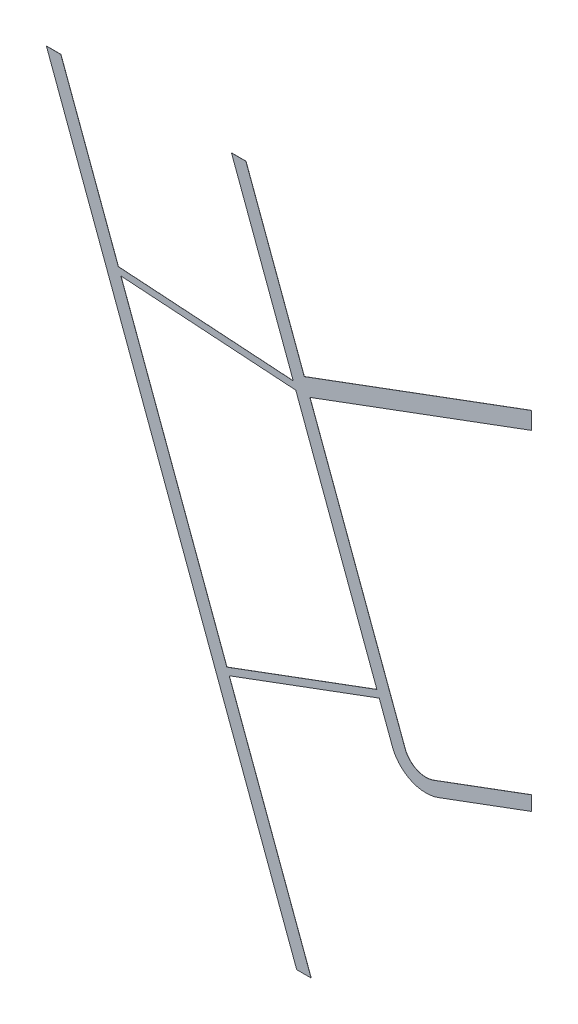
ISO-10303-21;
HEADER;
FILE_DESCRIPTION(('STEP AP214'),'2;1');
FILE_NAME('part.step','',(''),(''),'','','');
FILE_SCHEMA(('AUTOMOTIVE_DESIGN { 1 0 10303 214 1 1 1 1 }'));
ENDSEC;
DATA;
#1=APPLICATION_CONTEXT('core data for automotive mechanical design processes');
#2=APPLICATION_PROTOCOL_DEFINITION('international standard','automotive_design',2000,#1);
#3=PRODUCT_CONTEXT('',#1,'mechanical');
#4=PRODUCT('Part','Part','',(#3));
#5=PRODUCT_RELATED_PRODUCT_CATEGORY('part','',(#4));
#6=PRODUCT_DEFINITION_FORMATION('','',#4);
#7=PRODUCT_DEFINITION_CONTEXT('part definition',#1,'design');
#8=PRODUCT_DEFINITION('design','',#6,#7);
#9=PRODUCT_DEFINITION_SHAPE('','',#8);
#10=(LENGTH_UNIT() NAMED_UNIT(*) SI_UNIT(.MILLI.,.METRE.));
#11=(NAMED_UNIT(*) PLANE_ANGLE_UNIT() SI_UNIT($,.RADIAN.));
#12=(NAMED_UNIT(*) SI_UNIT($,.STERADIAN.) SOLID_ANGLE_UNIT());
#13=UNCERTAINTY_MEASURE_WITH_UNIT(LENGTH_MEASURE(1.E-05),#10,'distance_accuracy_value','');
#14=(GEOMETRIC_REPRESENTATION_CONTEXT(3) GLOBAL_UNCERTAINTY_ASSIGNED_CONTEXT((#13)) GLOBAL_UNIT_ASSIGNED_CONTEXT((#10,
#11,#12)) REPRESENTATION_CONTEXT('',''));
#15=CARTESIAN_POINT('',(0.,0.,0.));
#16=DIRECTION('',(0.,0.,1.));
#17=DIRECTION('',(1.,0.,0.));
#18=AXIS2_PLACEMENT_3D('',#15,#16,#17);
#19=CARTESIAN_POINT('',(105886.022376509,39280.2986235443,0.));
#20=DIRECTION('',(-0.937423422533661,-0.347753850294752,0.0174524064372835));
#21=DIRECTION('',(0.347806822958529,-0.937566218409929,0.));
#22=AXIS2_PLACEMENT_3D('',#19,#20,#21);
#23=PLANE('',#22);
#24=DIRECTION('',(-0.347806822958529,0.937566218409929,0.));
#25=VECTOR('',#24,1.);
#26=CARTESIAN_POINT('',(105886.022376509,39280.2986235443,0.));
#27=LINE('',#26,#25);
#28=CARTESIAN_POINT('',(135462.997839648,-40448.9395814397,0.));
#29=VERTEX_POINT('',#28);
#30=CARTESIAN_POINT('',(75362.2991137215,121561.639592795,0.));
#31=VERTEX_POINT('',#30);
#32=EDGE_CURVE('E273',#29,#31,#27,.T.);
#33=ORIENTED_EDGE('',*,*,#32,.F.);
#34=DIRECTION('',(-0.0224294371497834,0.0102911535157828,-0.999695459881888));
#35=VECTOR('',#34,1.);
#36=CARTESIAN_POINT('',(135429.714781213,-40433.6685310986,-1483.44883498776));
#37=LINE('',#36,#35);
#38=CARTESIAN_POINT('',(135465.241466638,-40449.9690102937,100.));
#39=VERTEX_POINT('',#38);
#40=EDGE_CURVE('E11',#39,#29,#37,.T.);
#41=ORIENTED_EDGE('',*,*,#40,.F.);
#42=DIRECTION('',(-0.347806822958529,0.937566218409929,0.));
#43=VECTOR('',#42,1.);
#44=CARTESIAN_POINT('',(105887.65890443,39280.905722612,100.));
#45=LINE('',#44,#43);
#46=CARTESIAN_POINT('',(75363.5422398978,121563.307166133,100.));
#47=VERTEX_POINT('',#46);
#48=EDGE_CURVE('E372',#39,#47,#45,.T.);
#49=ORIENTED_EDGE('',*,*,#48,.T.);
#50=DIRECTION('',(-0.012428573650737,-0.0166721274536834,-0.999783761982148));
#51=VECTOR('',#50,1.);
#52=CARTESIAN_POINT('',(75352.8503053564,121548.964627688,-760.084418298319));
#53=LINE('',#52,#51);
#54=EDGE_CURVE('E52',#47,#31,#53,.T.);
#55=ORIENTED_EDGE('',*,*,#54,.T.);
#56=EDGE_LOOP('',(#33,#41,#49,#55));
#57=FACE_BOUND('',#56,.T.);
#58=ADVANCED_FACE('F35',(#57),#23,.T.);
#59=CARTESIAN_POINT('',(29576.9754631399,-79729.2382049841,0.));
#60=DIRECTION('',(-0.347753850294752,0.937423422533661,0.0174524064372835));
#61=DIRECTION('',(-0.937566218409929,-0.347806822958529,0.));
#62=AXIS2_PLACEMENT_3D('',#59,#60,#61);
#63=PLANE('',#62);
#64=DIRECTION('',(0.937566218409929,0.347806822958529,0.));
#65=VECTOR('',#64,1.);
#66=CARTESIAN_POINT('',(29576.9754631399,-79729.2382049841,0.));
#67=LINE('',#66,#65);
#68=CARTESIAN_POINT('',(24270.0392753806,-81697.9403391529,0.));
#69=VERTEX_POINT('',#68);
#70=EDGE_CURVE('E276',#69,#29,#67,.T.);
#71=ORIENTED_EDGE('',*,*,#70,.F.);
#72=DIRECTION('',(-0.0102911535157828,-0.0224294371497834,0.999695459881888));
#73=VECTOR('',#72,1.);
#74=CARTESIAN_POINT('',(24285.3103257218,-81664.657280717,-1483.44883498776));
#75=LINE('',#74,#73);
#76=CARTESIAN_POINT('',(24269.0098465267,-81700.1839661423,100.));
#77=VERTEX_POINT('',#76);
#78=EDGE_CURVE('E44',#77,#69,#75,.F.);
#79=ORIENTED_EDGE('',*,*,#78,.F.);
#80=DIRECTION('',(0.937566218409929,0.347806822958529,0.));
#81=VECTOR('',#80,1.);
#82=CARTESIAN_POINT('',(29577.5825622076,-79730.8747329058,100.));
#83=LINE('',#82,#81);
#84=EDGE_CURVE('E379',#77,#39,#83,.T.);
#85=ORIENTED_EDGE('',*,*,#84,.T.);
#86=ORIENTED_EDGE('',*,*,#40,.T.);
#87=EDGE_LOOP('',(#71,#79,#85,#86));
#88=FACE_BOUND('',#87,.T.);
#89=ADVANCED_FACE('F37',(#88),#63,.T.);
#90=CARTESIAN_POINT('',(-5306.93618775923,-1968.70213416878,0.));
#91=DIRECTION('',(0.937423422533661,0.347753850294752,0.0174524064372835));
#92=DIRECTION('',(-0.347806822958529,0.937566218409929,0.));
#93=AXIS2_PLACEMENT_3D('',#90,#91,#92);
#94=PLANE('',#93);
#95=DIRECTION('',(-0.347806822958529,0.937566218409929,0.));
#96=VECTOR('',#95,1.);
#97=CARTESIAN_POINT('',(-5306.93618775923,-1968.70213416878,0.));
#98=LINE('',#97,#96);
#99=CARTESIAN_POINT('',(-54293.7378771381,130082.67633285,0.));
#100=VERTEX_POINT('',#99);
#101=EDGE_CURVE('E279',#69,#100,#98,.T.);
#102=ORIENTED_EDGE('',*,*,#101,.T.);
#103=DIRECTION('',(-0.0257208088566021,0.0191740956946787,0.999485264546733));
#104=VECTOR('',#103,1.);
#105=CARTESIAN_POINT('',(-54250.3143081011,130050.305357553,-1687.39706548793));
#106=LINE('',#105,#104);
#107=CARTESIAN_POINT('',(-54296.3112826469,130084.594729886,100.));
#108=VERTEX_POINT('',#107);
#109=EDGE_CURVE('E375',#108,#100,#106,.F.);
#110=ORIENTED_EDGE('',*,*,#109,.F.);
#111=DIRECTION('',(0.347806822958529,-0.937566218409929,0.));
#112=VECTOR('',#111,1.);
#113=CARTESIAN_POINT('',(-5308.57271568091,-1969.30923323651,100.));
#114=LINE('',#113,#112);
#115=EDGE_CURVE('E60',#77,#108,#114,.F.);
#116=ORIENTED_EDGE('',*,*,#115,.F.);
#117=ORIENTED_EDGE('',*,*,#78,.T.);
#118=EDGE_LOOP('',(#102,#110,#116,#117));
#119=FACE_BOUND('',#118,.T.);
#120=ADVANCED_FACE('F390',(#119),#94,.T.);
#121=CARTESIAN_POINT('',(171789.188269937,-62216.0640065166,0.));
#122=DIRECTION('',(0.,0.,1.));
#123=DIRECTION('',(1.,0.,0.));
#124=AXIS2_PLACEMENT_3D('',#121,#122,#123);
#125=CONICAL_SURFACE('',#124,16487.4545997351,0.0174532925199433);
#126=CARTESIAN_POINT('',(171789.188269937,-62216.0640065166,0.));
#127=DIRECTION('',(0.,0.,1.));
#128=DIRECTION('',(1.,0.,0.));
#129=AXIS2_PLACEMENT_3D('',#126,#127,#128);
#130=CIRCLE('',#129,16487.4545997351);
#131=CARTESIAN_POINT('',(156331.107809658,-67950.5132095235,0.));
#132=VERTEX_POINT('',#131);
#133=CARTESIAN_POINT('',(177523.637472943,-77674.1444667957,0.));
#134=VERTEX_POINT('',#133);
#135=EDGE_CURVE('E218',#132,#134,#130,.T.);
#136=ORIENTED_EDGE('',*,*,#135,.F.);
#137=DIRECTION('',(0.016362786705557,0.00607006603593257,-0.999847695156391));
#138=VECTOR('',#137,1.);
#139=CARTESIAN_POINT('',(156331.107809658,-67950.5132095235,-1.23969035357567E-13));
#140=LINE('',#139,#138);
#141=CARTESIAN_POINT('',(156329.471281736,-67951.1203085913,100.));
#142=VERTEX_POINT('',#141);
#143=EDGE_CURVE('E199',#142,#132,#140,.T.);
#144=ORIENTED_EDGE('',*,*,#143,.F.);
#145=CARTESIAN_POINT('',(171789.188269937,-62216.0640065166,100.));
#146=DIRECTION('',(0.,0.,1.));
#147=DIRECTION('',(1.,0.,0.));
#148=AXIS2_PLACEMENT_3D('',#145,#146,#147);
#149=CIRCLE('',#148,16489.200106228);
#150=CARTESIAN_POINT('',(177524.244572011,-77675.7809947174,100.));
#151=VERTEX_POINT('',#150);
#152=EDGE_CURVE('E284',#142,#151,#149,.T.);
#153=ORIENTED_EDGE('',*,*,#152,.T.);
#154=DIRECTION('',(-0.00607006603593255,0.016362786705557,-0.999847695156391));
#155=VECTOR('',#154,1.);
#156=CARTESIAN_POINT('',(177523.637472943,-77674.1444667957,-1.85981878977343E-13));
#157=LINE('',#156,#155);
#158=EDGE_CURVE('E224',#151,#134,#157,.T.);
#159=ORIENTED_EDGE('',*,*,#158,.T.);
#160=EDGE_LOOP('',(#136,#144,#153,#159));
#161=FACE_BOUND('',#160,.T.);
#162=ADVANCED_FACE('F223',(#161),#125,.F.);
#163=CARTESIAN_POINT('',(115261.684560608,42758.3668531296,0.));
#164=DIRECTION('',(0.937423422533661,0.347753850294752,0.0174524064372835));
#165=DIRECTION('',(-0.347806822958529,0.937566218409929,0.));
#166=AXIS2_PLACEMENT_3D('',#163,#164,#165);
#167=PLANE('',#166);
#168=DIRECTION('',(-0.347806822958529,0.937566218409929,0.));
#169=VECTOR('',#168,1.);
#170=CARTESIAN_POINT('',(115261.684560608,42758.3668531296,0.));
#171=LINE('',#170,#169);
#172=CARTESIAN_POINT('',(85803.0786017647,122168.522046532,0.));
#173=VERTEX_POINT('',#172);
#174=EDGE_CURVE('E203',#132,#173,#171,.T.);
#175=ORIENTED_EDGE('',*,*,#174,.T.);
#176=DIRECTION('',(0.0224294371497834,-0.0102911535157828,-0.999695459881888));
#177=VECTOR('',#176,1.);
#178=CARTESIAN_POINT('',(85836.2284586453,122153.312112198,-1477.51194994468));
#179=LINE('',#178,#177);
#180=CARTESIAN_POINT('',(85800.8349747753,122169.551475386,100.));
#181=VERTEX_POINT('',#180);
#182=EDGE_CURVE('E210',#181,#173,#179,.T.);
#183=ORIENTED_EDGE('',*,*,#182,.F.);
#184=DIRECTION('',(0.347806822958529,-0.937566218409929,0.));
#185=VECTOR('',#184,1.);
#186=CARTESIAN_POINT('',(115260.048032686,42757.7597540619,100.));
#187=LINE('',#186,#185);
#188=EDGE_CURVE('E205',#142,#181,#187,.F.);
#189=ORIENTED_EDGE('',*,*,#188,.F.);
#190=ORIENTED_EDGE('',*,*,#143,.T.);
#191=EDGE_LOOP('',(#175,#183,#189,#190));
#192=FACE_BOUND('',#191,.T.);
#193=ADVANCED_FACE('F201',(#192),#167,.T.);
#194=CARTESIAN_POINT('',(-29458.6059588433,79410.1551934018,0.));
#195=DIRECTION('',(0.347753850294754,-0.937423422533661,0.0174524064372835));
#196=DIRECTION('',(0.937566218409928,0.347806822958531,0.));
#197=AXIS2_PLACEMENT_3D('',#194,#195,#196);
#198=PLANE('',#197);
#199=DIRECTION('',(0.937566218409928,0.347806822958531,0.));
#200=VECTOR('',#199,1.);
#201=CARTESIAN_POINT('',(-29458.6059588433,79410.1551934018,0.));
#202=LINE('',#201,#200);
#203=CARTESIAN_POINT('',(250000.,183080.283210395,0.));
#204=VERTEX_POINT('',#203);
#205=EDGE_CURVE('E221',#173,#204,#202,.T.);
#206=ORIENTED_EDGE('',*,*,#205,.T.);
#207=DIRECTION('',(0.0174511204503486,-0.0121394110260807,-0.999774021014233));
#208=VECTOR('',#207,1.);
#209=CARTESIAN_POINT('',(250038.784884997,183053.303529524,-2221.98457334734));
#210=LINE('',#209,#208);
#211=CARTESIAN_POINT('',(249998.254493507,183081.497425885,100.));
#212=VERTEX_POINT('',#211);
#213=EDGE_CURVE('E324',#212,#204,#210,.T.);
#214=ORIENTED_EDGE('',*,*,#213,.F.);
#215=DIRECTION('',(-0.937566218409928,-0.347806822958531,0.));
#216=VECTOR('',#215,1.);
#217=CARTESIAN_POINT('',(-29459.2130579111,79411.7917213235,100.));
#218=LINE('',#217,#216);
#219=EDGE_CURVE('E330',#181,#212,#218,.F.);
#220=ORIENTED_EDGE('',*,*,#219,.F.);
#221=ORIENTED_EDGE('',*,*,#182,.T.);
#222=EDGE_LOOP('',(#206,#214,#220,#221));
#223=FACE_BOUND('',#222,.T.);
#224=ADVANCED_FACE('F409',(#223),#198,.T.);
#225=CARTESIAN_POINT('',(249999.999999999,-1.1103014429754E-09,0.));
#226=DIRECTION('',(0.999847695156391,0.,0.0174524064372835));
#227=DIRECTION('',(0.0174524064372835,0.,-0.999847695156391));
#228=AXIS2_PLACEMENT_3D('',#225,#226,#227);
#229=PLANE('',#228);
#230=DIRECTION('',(0.,1.,0.));
#231=VECTOR('',#230,1.);
#232=CARTESIAN_POINT('',(249999.999999999,-1.1103014429754E-09,0.));
#233=LINE('',#232,#231);
#234=CARTESIAN_POINT('',(250000.,195879.379172226,0.));
#235=VERTEX_POINT('',#234);
#236=EDGE_CURVE('E228',#204,#235,#233,.T.);
#237=ORIENTED_EDGE('',*,*,#236,.T.);
#238=DIRECTION('',(-0.0174469163102588,-0.0250809728217744,0.999533165989792));
#239=VECTOR('',#238,1.);
#240=CARTESIAN_POINT('',(249914.285997716,195756.160230638,4910.5519020519));
#241=LINE('',#240,#239);
#242=CARTESIAN_POINT('',(249998.254493507,195876.869903532,100.));
#243=VERTEX_POINT('',#242);
#244=EDGE_CURVE('E322',#243,#235,#241,.F.);
#245=ORIENTED_EDGE('',*,*,#244,.F.);
#246=DIRECTION('',(0.,-1.,0.));
#247=VECTOR('',#246,1.);
#248=CARTESIAN_POINT('',(249998.254493506,-1.11029369082189E-09,100.));
#249=LINE('',#248,#247);
#250=EDGE_CURVE('E332',#212,#243,#249,.F.);
#251=ORIENTED_EDGE('',*,*,#250,.F.);
#252=ORIENTED_EDGE('',*,*,#213,.T.);
#253=EDGE_LOOP('',(#237,#245,#251,#252));
#254=FACE_BOUND('',#253,.T.);
#255=ADVANCED_FACE('F475',(#254),#229,.T.);
#256=CARTESIAN_POINT('',(-33632.2878343457,90660.9498143214,0.));
#257=DIRECTION('',(-0.347753850294752,0.937423422533661,0.0174524064372835));
#258=DIRECTION('',(-0.937566218409929,-0.347806822958529,0.));
#259=AXIS2_PLACEMENT_3D('',#256,#257,#258);
#260=PLANE('',#259);
#261=DIRECTION('',(0.937566218409929,0.347806822958529,0.));
#262=VECTOR('',#261,1.);
#263=CARTESIAN_POINT('',(-33632.2878343457,90660.9498143214,0.));
#264=LINE('',#263,#262);
#265=CARTESIAN_POINT('',(81629.3967262622,133419.316667451,0.));
#266=VERTEX_POINT('',#265);
#267=EDGE_CURVE('E231',#266,#235,#264,.T.);
#268=ORIENTED_EDGE('',*,*,#267,.F.);
#269=DIRECTION('',(-0.0102911535157828,-0.0224294371497834,0.999695459881888));
#270=VECTOR('',#269,1.);
#271=CARTESIAN_POINT('',(81612.0318553596,133381.470153945,1686.84517008883));
#272=LINE('',#271,#270);
#273=CARTESIAN_POINT('',(81628.3672974083,133417.073040462,100.));
#274=VERTEX_POINT('',#273);
#275=EDGE_CURVE('E320',#274,#266,#272,.F.);
#276=ORIENTED_EDGE('',*,*,#275,.F.);
#277=DIRECTION('',(0.937566218409929,0.347806822958529,0.));
#278=VECTOR('',#277,1.);
#279=CARTESIAN_POINT('',(-33631.680735278,90659.3132863997,100.));
#280=LINE('',#279,#278);
#281=EDGE_CURVE('E334',#274,#243,#280,.T.);
#282=ORIENTED_EDGE('',*,*,#281,.T.);
#283=ORIENTED_EDGE('',*,*,#244,.T.);
#284=EDGE_LOOP('',(#268,#276,#282,#283));
#285=FACE_BOUND('',#284,.T.);
#286=ADVANCED_FACE('F471',(#285),#260,.T.);
#287=CARTESIAN_POINT('',(115261.684560608,42758.3668531296,0.));
#288=DIRECTION('',(0.937423422533661,0.347753850294752,0.0174524064372835));
#289=DIRECTION('',(-0.347806822958529,0.937566218409929,0.));
#290=AXIS2_PLACEMENT_3D('',#287,#288,#289);
#291=PLANE('',#290);
#292=DIRECTION('',(-0.347806822958529,0.937566218409929,0.));
#293=VECTOR('',#292,1.);
#294=CARTESIAN_POINT('',(115261.684560608,42758.3668531296,0.));
#295=LINE('',#294,#293);
#296=CARTESIAN_POINT('',(38381.7238770899,250000.,0.));
#297=VERTEX_POINT('',#296);
#298=EDGE_CURVE('E234',#266,#297,#295,.T.);
#299=ORIENTED_EDGE('',*,*,#298,.T.);
#300=DIRECTION('',(-0.0121394110260807,-0.0174511204503486,0.999774021014233));
#301=VECTOR('',#300,1.);
#302=CARTESIAN_POINT('',(38349.1499374002,249953.173037485,2682.71488575004));
#303=LINE('',#302,#301);
#304=CARTESIAN_POINT('',(38380.5096616002,249998.254493507,100.));
#305=VERTEX_POINT('',#304);
#306=EDGE_CURVE('E318',#305,#297,#303,.F.);
#307=ORIENTED_EDGE('',*,*,#306,.F.);
#308=DIRECTION('',(0.347806822958529,-0.937566218409929,0.));
#309=VECTOR('',#308,1.);
#310=CARTESIAN_POINT('',(115260.048032686,42757.7597540619,100.));
#311=LINE('',#310,#309);
#312=EDGE_CURVE('E337',#274,#305,#311,.F.);
#313=ORIENTED_EDGE('',*,*,#312,.F.);
#314=ORIENTED_EDGE('',*,*,#275,.T.);
#315=EDGE_LOOP('',(#299,#307,#313,#314));
#316=FACE_BOUND('',#315,.T.);
#317=ADVANCED_FACE('F467',(#316),#291,.T.);
#318=CARTESIAN_POINT('',(0.,250000.,0.));
#319=DIRECTION('',(0.,0.999847695156391,0.0174524064372835));
#320=DIRECTION('',(0.,-0.0174524064372835,0.999847695156391));
#321=AXIS2_PLACEMENT_3D('',#318,#319,#320);
#322=PLANE('',#321);
#323=DIRECTION('',(1.,0.,0.));
#324=VECTOR('',#323,1.);
#325=CARTESIAN_POINT('',(0.,250000.,0.));
#326=LINE('',#325,#324);
#327=CARTESIAN_POINT('',(27715.8105755638,250000.,0.));
#328=VERTEX_POINT('',#327);
#329=EDGE_CURVE('E237',#328,#297,#326,.T.);
#330=ORIENTED_EDGE('',*,*,#329,.F.);
#331=DIRECTION('',(-0.0250809728217743,0.0174469163102587,-0.999533165989792));
#332=VECTOR('',#331,1.);
#333=CARTESIAN_POINT('',(27857.1918676827,249901.65183827,5634.36241199722));
#334=LINE('',#333,#332);
#335=CARTESIAN_POINT('',(27718.319844258,249998.254493507,100.));
#336=VERTEX_POINT('',#335);
#337=EDGE_CURVE('E316',#336,#328,#334,.T.);
#338=ORIENTED_EDGE('',*,*,#337,.F.);
#339=DIRECTION('',(1.,0.,0.));
#340=VECTOR('',#339,1.);
#341=CARTESIAN_POINT('',(0.,249998.254493507,100.));
#342=LINE('',#341,#340);
#343=EDGE_CURVE('E339',#336,#305,#342,.T.);
#344=ORIENTED_EDGE('',*,*,#343,.T.);
#345=ORIENTED_EDGE('',*,*,#306,.T.);
#346=EDGE_LOOP('',(#330,#338,#344,#345));
#347=FACE_BOUND('',#346,.T.);
#348=ADVANCED_FACE('F463',(#347),#322,.T.);
#349=CARTESIAN_POINT('',(105886.022376509,39280.2986235443,0.));
#350=DIRECTION('',(-0.937423422533661,-0.347753850294752,0.0174524064372835));
#351=DIRECTION('',(0.347806822958529,-0.937566218409929,0.));
#352=AXIS2_PLACEMENT_3D('',#349,#350,#351);
#353=PLANE('',#352);
#354=DIRECTION('',(-0.347806822958529,0.937566218409929,0.));
#355=VECTOR('',#354,1.);
#356=CARTESIAN_POINT('',(105886.022376509,39280.2986235443,0.));
#357=LINE('',#356,#355);
#358=CARTESIAN_POINT('',(73507.4604040441,126561.639592795,0.));
#359=VERTEX_POINT('',#358);
#360=EDGE_CURVE('E240',#359,#328,#357,.T.);
#361=ORIENTED_EDGE('',*,*,#360,.F.);
#362=DIRECTION('',(0.0257208088566021,-0.0191740956946787,0.999485264546733));
#363=VECTOR('',#362,1.);
#364=CARTESIAN_POINT('',(73462.4151057434,126595.219518878,-1750.41586520992));
#365=LINE('',#364,#363);
#366=CARTESIAN_POINT('',(73510.0338095528,126559.721195758,100.));
#367=VERTEX_POINT('',#366);
#368=EDGE_CURVE('E314',#367,#359,#365,.F.);
#369=ORIENTED_EDGE('',*,*,#368,.F.);
#370=DIRECTION('',(-0.347806822958529,0.937566218409929,0.));
#371=VECTOR('',#370,1.);
#372=CARTESIAN_POINT('',(105887.65890443,39280.9057226121,100.));
#373=LINE('',#372,#371);
#374=EDGE_CURVE('E342',#367,#336,#373,.T.);
#375=ORIENTED_EDGE('',*,*,#374,.T.);
#376=ORIENTED_EDGE('',*,*,#337,.T.);
#377=EDGE_LOOP('',(#361,#369,#375,#376));
#378=FACE_BOUND('',#377,.T.);
#379=ADVANCED_FACE('F459',(#378),#353,.T.);
#380=CARTESIAN_POINT('',(8598.02623537787,130827.508627234,0.));
#381=DIRECTION('',(0.0655688656533903,0.997695413122901,0.0174524064372835));
#382=DIRECTION('',(-0.997847390113597,0.0655788536304365,0.));
#383=AXIS2_PLACEMENT_3D('',#380,#381,#382);
#384=PLANE('',#383);
#385=DIRECTION('',(-0.997847390113597,0.0655788536304366,0.));
#386=VECTOR('',#385,1.);
#387=CARTESIAN_POINT('',(8598.02623537787,130827.508627234,0.));
#388=LINE('',#387,#386);
#389=CARTESIAN_POINT('',(-56148.5765868156,135082.67633285,0.));
#390=VERTEX_POINT('',#389);
#391=EDGE_CURVE('E243',#359,#390,#388,.T.);
#392=ORIENTED_EDGE('',*,*,#391,.T.);
#393=DIRECTION('',(0.012428573650737,0.0166721274536834,-0.999783761982148));
#394=VECTOR('',#393,1.);
#395=CARTESIAN_POINT('',(-56139.4569316931,135094.909760177,-733.606555548322));
#396=LINE('',#395,#394);
#397=CARTESIAN_POINT('',(-56149.8197129918,135081.008759512,100.));
#398=VERTEX_POINT('',#397);
#399=EDGE_CURVE('E311',#398,#390,#396,.T.);
#400=ORIENTED_EDGE('',*,*,#399,.F.);
#401=DIRECTION('',(0.997847390113597,-0.0655788536304365,0.));
#402=VECTOR('',#401,1.);
#403=CARTESIAN_POINT('',(8597.91176706307,130825.766878136,100.));
#404=LINE('',#403,#402);
#405=EDGE_CURVE('E345',#367,#398,#404,.F.);
#406=ORIENTED_EDGE('',*,*,#405,.F.);
#407=ORIENTED_EDGE('',*,*,#368,.T.);
#408=EDGE_LOOP('',(#392,#400,#406,#407));
#409=FACE_BOUND('',#408,.T.);
#410=ADVANCED_FACE('F455',(#409),#384,.T.);
#411=CARTESIAN_POINT('',(-5306.93618775918,-1968.70213416877,0.));
#412=DIRECTION('',(0.937423422533661,0.347753850294752,0.0174524064372835));
#413=DIRECTION('',(-0.347806822958529,0.937566218409929,0.));
#414=AXIS2_PLACEMENT_3D('',#411,#412,#413);
#415=PLANE('',#414);
#416=DIRECTION('',(-0.347806822958529,0.937566218409929,0.));
#417=VECTOR('',#416,1.);
#418=CARTESIAN_POINT('',(-5306.93618775918,-1968.70213416877,0.));
#419=LINE('',#418,#417);
#420=CARTESIAN_POINT('',(-98779.1966568882,250000.,0.));
#421=VERTEX_POINT('',#420);
#422=EDGE_CURVE('E245',#390,#421,#419,.T.);
#423=ORIENTED_EDGE('',*,*,#422,.T.);
#424=DIRECTION('',(-0.0121394110260807,-0.0174511204503486,0.999774021014233));
#425=VECTOR('',#424,1.);
#426=CARTESIAN_POINT('',(-98818.8007324902,249943.066801827,3261.70073886363));
#427=LINE('',#426,#425);
#428=CARTESIAN_POINT('',(-98780.410872378,249998.254493507,100.));
#429=VERTEX_POINT('',#428);
#430=EDGE_CURVE('E309',#429,#421,#427,.F.);
#431=ORIENTED_EDGE('',*,*,#430,.F.);
#432=DIRECTION('',(0.347806822958529,-0.937566218409929,0.));
#433=VECTOR('',#432,1.);
#434=CARTESIAN_POINT('',(-5308.57271568087,-1969.30923323649,100.));
#435=LINE('',#434,#433);
#436=EDGE_CURVE('E347',#398,#429,#435,.F.);
#437=ORIENTED_EDGE('',*,*,#436,.F.);
#438=ORIENTED_EDGE('',*,*,#399,.T.);
#439=EDGE_LOOP('',(#423,#431,#437,#438));
#440=FACE_BOUND('',#439,.T.);
#441=ADVANCED_FACE('F451',(#440),#415,.T.);
#442=CARTESIAN_POINT('',(0.,250000.,0.));
#443=DIRECTION('',(0.,0.999847695156391,0.0174524064372835));
#444=DIRECTION('',(0.,-0.0174524064372835,0.999847695156391));
#445=AXIS2_PLACEMENT_3D('',#442,#443,#444);
#446=PLANE('',#445);
#447=DIRECTION('',(1.,0.,0.));
#448=VECTOR('',#447,1.);
#449=CARTESIAN_POINT('',(0.,250000.,0.));
#450=LINE('',#449,#448);
#451=CARTESIAN_POINT('',(-109445.109958414,250000.,0.));
#452=VERTEX_POINT('',#451);
#453=EDGE_CURVE('E248',#452,#421,#450,.T.);
#454=ORIENTED_EDGE('',*,*,#453,.F.);
#455=DIRECTION('',(-0.0250809728217743,0.0174469163102587,-0.999533165989792));
#456=VECTOR('',#455,1.);
#457=CARTESIAN_POINT('',(-109273.719271043,249880.776595064,6830.30429429241));
#458=LINE('',#457,#456);
#459=CARTESIAN_POINT('',(-109442.60068972,249998.254493507,100.));
#460=VERTEX_POINT('',#459);
#461=EDGE_CURVE('E307',#460,#452,#458,.T.);
#462=ORIENTED_EDGE('',*,*,#461,.F.);
#463=DIRECTION('',(1.,0.,0.));
#464=VECTOR('',#463,1.);
#465=CARTESIAN_POINT('',(0.,249998.254493507,100.));
#466=LINE('',#465,#464);
#467=EDGE_CURVE('E349',#460,#429,#466,.T.);
#468=ORIENTED_EDGE('',*,*,#467,.T.);
#469=ORIENTED_EDGE('',*,*,#430,.T.);
#470=EDGE_LOOP('',(#454,#462,#468,#469));
#471=FACE_BOUND('',#470,.T.);
#472=ADVANCED_FACE('F447',(#471),#446,.T.);
#473=CARTESIAN_POINT('',(-14682.5983718585,-5446.77036375407,0.));
#474=DIRECTION('',(-0.937423422533661,-0.347753850294752,0.0174524064372835));
#475=DIRECTION('',(0.347806822958529,-0.937566218409929,0.));
#476=AXIS2_PLACEMENT_3D('',#473,#474,#475);
#477=PLANE('',#476);
#478=DIRECTION('',(-0.347806822958529,0.937566218409929,0.));
#479=VECTOR('',#478,1.);
#480=CARTESIAN_POINT('',(-14682.5983718585,-5446.77036375407,0.));
#481=LINE('',#480,#479);
#482=CARTESIAN_POINT('',(76038.7610093313,-250000.,0.));
#483=VERTEX_POINT('',#482);
#484=EDGE_CURVE('E251',#483,#452,#481,.T.);
#485=ORIENTED_EDGE('',*,*,#484,.F.);
#486=DIRECTION('',(0.0121394110260807,0.0174511204503487,0.999774021014233));
#487=VECTOR('',#486,1.);
#488=CARTESIAN_POINT('',(76077.199531708,-249944.74235344,3165.70845124762));
#489=LINE('',#488,#487);
#490=CARTESIAN_POINT('',(76039.9752248211,-249998.254493507,100.));
#491=VERTEX_POINT('',#490);
#492=EDGE_CURVE('E305',#491,#483,#489,.F.);
#493=ORIENTED_EDGE('',*,*,#492,.F.);
#494=DIRECTION('',(-0.347806822958529,0.937566218409929,0.));
#495=VECTOR('',#494,1.);
#496=CARTESIAN_POINT('',(-14680.9618439368,-5446.16326468635,100.));
#497=LINE('',#496,#495);
#498=EDGE_CURVE('E352',#491,#460,#497,.T.);
#499=ORIENTED_EDGE('',*,*,#498,.T.);
#500=ORIENTED_EDGE('',*,*,#461,.T.);
#501=EDGE_LOOP('',(#485,#493,#499,#500));
#502=FACE_BOUND('',#501,.T.);
#503=ADVANCED_FACE('F443',(#502),#477,.T.);
#504=CARTESIAN_POINT('',(6.66180865785242E-10,-250000.,0.));
#505=DIRECTION('',(0.,-0.999847695156391,0.0174524064372835));
#506=DIRECTION('',(0.,-0.0174524064372835,-0.999847695156391));
#507=AXIS2_PLACEMENT_3D('',#504,#505,#506);
#508=PLANE('',#507);
#509=DIRECTION('',(1.,0.,0.));
#510=VECTOR('',#509,1.);
#511=CARTESIAN_POINT('',(6.66180865785242E-10,-250000.,0.));
#512=LINE('',#511,#510);
#513=CARTESIAN_POINT('',(86704.6743108574,-250000.,0.));
#514=VERTEX_POINT('',#513);
#515=EDGE_CURVE('E254',#483,#514,#512,.T.);
#516=ORIENTED_EDGE('',*,*,#515,.T.);
#517=DIRECTION('',(0.0250809728217743,-0.0174469163102587,-0.999533165989792));
#518=VECTOR('',#517,1.);
#519=CARTESIAN_POINT('',(86538.2589963466,-249884.237581786,6632.02449778275));
#520=LINE('',#519,#518);
#521=CARTESIAN_POINT('',(86702.1650421633,-249998.254493507,100.));
#522=VERTEX_POINT('',#521);
#523=EDGE_CURVE('E302',#522,#514,#520,.T.);
#524=ORIENTED_EDGE('',*,*,#523,.F.);
#525=DIRECTION('',(-1.,0.,0.));
#526=VECTOR('',#525,1.);
#527=CARTESIAN_POINT('',(6.66176214493136E-10,-249998.254493507,100.));
#528=LINE('',#527,#526);
#529=EDGE_CURVE('E355',#491,#522,#528,.F.);
#530=ORIENTED_EDGE('',*,*,#529,.F.);
#531=ORIENTED_EDGE('',*,*,#492,.T.);
#532=EDGE_LOOP('',(#516,#524,#530,#531));
#533=FACE_BOUND('',#532,.T.);
#534=ADVANCED_FACE('F439',(#533),#508,.T.);
#535=CARTESIAN_POINT('',(-5306.9361877592,-1968.70213416878,0.));
#536=DIRECTION('',(0.937423422533661,0.347753850294752,0.0174524064372835));
#537=DIRECTION('',(-0.347806822958529,0.937566218409929,0.));
#538=AXIS2_PLACEMENT_3D('',#535,#536,#537);
#539=PLANE('',#538);
#540=DIRECTION('',(-0.347806822958529,0.937566218409929,0.));
#541=VECTOR('',#540,1.);
#542=CARTESIAN_POINT('',(-5306.9361877592,-1968.70213416878,0.));
#543=LINE('',#542,#541);
#544=CARTESIAN_POINT('',(26009.0733901733,-86385.7714312025,0.));
#545=VERTEX_POINT('',#544);
#546=EDGE_CURVE('E256',#514,#545,#543,.T.);
#547=ORIENTED_EDGE('',*,*,#546,.T.);
#548=DIRECTION('',(0.0224294371497834,-0.0102911535157828,-0.999695459881887));
#549=VECTOR('',#548,1.);
#550=CARTESIAN_POINT('',(25973.8333914771,-86369.6024906243,1570.67101004782));
#551=LINE('',#550,#549);
#552=CARTESIAN_POINT('',(26006.8297631839,-86384.7420023485,100.));
#553=VERTEX_POINT('',#552);
#554=EDGE_CURVE('E299',#553,#545,#551,.T.);
#555=ORIENTED_EDGE('',*,*,#554,.F.);
#556=DIRECTION('',(0.347806822958529,-0.937566218409929,0.));
#557=VECTOR('',#556,1.);
#558=CARTESIAN_POINT('',(-5308.57271568089,-1969.3092332365,100.));
#559=LINE('',#558,#557);
#560=EDGE_CURVE('E357',#522,#553,#559,.F.);
#561=ORIENTED_EDGE('',*,*,#560,.F.);
#562=ORIENTED_EDGE('',*,*,#523,.T.);
#563=EDGE_LOOP('',(#547,#555,#561,#562));
#564=FACE_BOUND('',#563,.T.);
#565=ADVANCED_FACE('F435',(#564),#539,.T.);
#566=CARTESIAN_POINT('',(31316.0095779325,-84417.0692970337,0.));
#567=DIRECTION('',(0.347753850294752,-0.937423422533661,0.0174524064372835));
#568=DIRECTION('',(0.937566218409929,0.347806822958529,0.));
#569=AXIS2_PLACEMENT_3D('',#566,#567,#568);
#570=PLANE('',#569);
#571=DIRECTION('',(0.937566218409929,0.347806822958529,0.));
#572=VECTOR('',#571,1.);
#573=CARTESIAN_POINT('',(31316.0095779325,-84417.0692970337,0.));
#574=LINE('',#573,#572);
#575=CARTESIAN_POINT('',(137202.031954441,-45136.7706734894,0.));
#576=VERTEX_POINT('',#575);
#577=EDGE_CURVE('E258',#545,#576,#574,.T.);
#578=ORIENTED_EDGE('',*,*,#577,.T.);
#579=DIRECTION('',(0.0102911535157828,0.0224294371497834,0.999695459881887));
#580=VECTOR('',#579,1.);
#581=CARTESIAN_POINT('',(137218.200895019,-45101.5306747932,1570.67101004783));
#582=LINE('',#581,#580);
#583=CARTESIAN_POINT('',(137203.061383295,-45134.5270465,100.));
#584=VERTEX_POINT('',#583);
#585=EDGE_CURVE('E297',#584,#576,#582,.F.);
#586=ORIENTED_EDGE('',*,*,#585,.F.);
#587=DIRECTION('',(-0.937566218409929,-0.347806822958529,0.));
#588=VECTOR('',#587,1.);
#589=CARTESIAN_POINT('',(31315.4024788648,-84415.432769112,100.));
#590=LINE('',#589,#588);
#591=EDGE_CURVE('E359',#553,#584,#590,.F.);
#592=ORIENTED_EDGE('',*,*,#591,.F.);
#593=ORIENTED_EDGE('',*,*,#554,.T.);
#594=EDGE_LOOP('',(#578,#586,#592,#593));
#595=FACE_BOUND('',#594,.T.);
#596=ADVANCED_FACE('F431',(#595),#570,.T.);
#597=CARTESIAN_POINT('',(105886.022376509,39280.2986235443,0.));
#598=DIRECTION('',(-0.937423422533661,-0.347753850294752,0.0174524064372835));
#599=DIRECTION('',(0.347806822958529,-0.937566218409929,0.));
#600=AXIS2_PLACEMENT_3D('',#597,#598,#599);
#601=PLANE('',#600);
#602=DIRECTION('',(-0.347806822958529,0.937566218409929,0.));
#603=VECTOR('',#602,1.);
#604=CARTESIAN_POINT('',(105886.022376509,39280.2986235443,0.));
#605=LINE('',#604,#603);
#606=CARTESIAN_POINT('',(146955.445625558,-71428.5814391088,0.));
#607=VERTEX_POINT('',#606);
#608=EDGE_CURVE('E261',#607,#576,#605,.T.);
#609=ORIENTED_EDGE('',*,*,#608,.F.);
#610=DIRECTION('',(-0.016362786705557,-0.00607006603593256,-0.999847695156391));
#611=VECTOR('',#610,1.);
#612=CARTESIAN_POINT('',(146955.445625558,-71428.5814391088,0.));
#613=LINE('',#612,#611);
#614=CARTESIAN_POINT('',(146957.08215348,-71427.9743400411,100.));
#615=VERTEX_POINT('',#614);
#616=EDGE_CURVE('E295',#615,#607,#613,.T.);
#617=ORIENTED_EDGE('',*,*,#616,.F.);
#618=DIRECTION('',(-0.347806822958529,0.937566218409929,0.));
#619=VECTOR('',#618,1.);
#620=CARTESIAN_POINT('',(105887.65890443,39280.9057226121,100.));
#621=LINE('',#620,#619);
#622=EDGE_CURVE('E361',#615,#584,#621,.T.);
#623=ORIENTED_EDGE('',*,*,#622,.T.);
#624=ORIENTED_EDGE('',*,*,#585,.T.);
#625=EDGE_LOOP('',(#609,#617,#623,#624));
#626=FACE_BOUND('',#625,.T.);
#627=ADVANCED_FACE('F427',(#626),#601,.T.);
#628=CARTESIAN_POINT('',(171797.003111387,-62213.1649524301,0.));
#629=DIRECTION('',(0.,0.,-1.));
#630=DIRECTION('',(1.,0.,0.));
#631=AXIS2_PLACEMENT_3D('',#628,#629,#630);
#632=CONICAL_SURFACE('',#631,26495.789841873,0.0174532925199433);
#633=CARTESIAN_POINT('',(171797.003111387,-62213.1649524301,0.));
#634=DIRECTION('',(0.,0.,1.));
#635=DIRECTION('',(1.,0.,0.));
#636=AXIS2_PLACEMENT_3D('',#633,#634,#635);
#637=CIRCLE('',#636,26495.789841873);
#638=CARTESIAN_POINT('',(181012.419598066,-87054.7224382592,0.));
#639=VERTEX_POINT('',#638);
#640=EDGE_CURVE('E264',#607,#639,#637,.T.);
#641=ORIENTED_EDGE('',*,*,#640,.T.);
#642=DIRECTION('',(0.00607006603593254,-0.016362786705557,-0.999847695156391));
#643=VECTOR('',#642,1.);
#644=CARTESIAN_POINT('',(181012.419598066,-87054.7224382591,-3.71907106072702E-13));
#645=LINE('',#644,#643);
#646=CARTESIAN_POINT('',(181011.812498998,-87053.0859103374,100.));
#647=VERTEX_POINT('',#646);
#648=EDGE_CURVE('E292',#647,#639,#645,.T.);
#649=ORIENTED_EDGE('',*,*,#648,.F.);
#650=CARTESIAN_POINT('',(171797.003111387,-62213.1649524301,100.));
#651=DIRECTION('',(0.,0.,1.));
#652=DIRECTION('',(1.,0.,0.));
#653=AXIS2_PLACEMENT_3D('',#650,#651,#652);
#654=CIRCLE('',#653,26494.0443353802);
#655=EDGE_CURVE('E364',#615,#647,#654,.T.);
#656=ORIENTED_EDGE('',*,*,#655,.F.);
#657=ORIENTED_EDGE('',*,*,#616,.T.);
#658=EDGE_LOOP('',(#641,#649,#656,#657));
#659=FACE_BOUND('',#658,.T.);
#660=ADVANCED_FACE('F423',(#659),#632,.T.);
#661=CARTESIAN_POINT('',(50284.8397357279,-135550.437548482,0.));
#662=DIRECTION('',(0.347753850294751,-0.937423422533662,0.0174524064372835));
#663=DIRECTION('',(0.93756621840993,0.347806822958527,0.));
#664=AXIS2_PLACEMENT_3D('',#661,#662,#663);
#665=PLANE('',#664);
#666=DIRECTION('',(0.937566218409929,0.347806822958527,0.));
#667=VECTOR('',#666,1.);
#668=CARTESIAN_POINT('',(50284.8397357279,-135550.437548482,0.));
#669=LINE('',#668,#667);
#670=CARTESIAN_POINT('',(250000.,-61462.5555149606,0.));
#671=VERTEX_POINT('',#670);
#672=EDGE_CURVE('E266',#639,#671,#669,.T.);
#673=ORIENTED_EDGE('',*,*,#672,.T.);
#674=DIRECTION('',(0.0174511204503486,-0.0121394110260807,-0.999774021014233));
#675=VECTOR('',#674,1.);
#676=CARTESIAN_POINT('',(249986.97938355,-61453.4980670247,745.950616843885));
#677=LINE('',#676,#675);
#678=CARTESIAN_POINT('',(249998.254493507,-61461.3412994709,100.));
#679=VERTEX_POINT('',#678);
#680=EDGE_CURVE('E289',#679,#671,#677,.T.);
#681=ORIENTED_EDGE('',*,*,#680,.F.);
#682=DIRECTION('',(-0.93756621840993,-0.347806822958527,0.));
#683=VECTOR('',#682,1.);
#684=CARTESIAN_POINT('',(50284.2326366602,-135548.80102056,100.));
#685=LINE('',#684,#683);
#686=EDGE_CURVE('E366',#647,#679,#685,.F.);
#687=ORIENTED_EDGE('',*,*,#686,.F.);
#688=ORIENTED_EDGE('',*,*,#648,.T.);
#689=EDGE_LOOP('',(#673,#681,#687,#688));
#690=FACE_BOUND('',#689,.T.);
#691=ADVANCED_FACE('F419',(#690),#665,.T.);
#692=CARTESIAN_POINT('',(250000.,0.,0.));
#693=DIRECTION('',(0.999847695156391,0.,0.0174524064372835));
#694=DIRECTION('',(0.0174524064372835,0.,-0.999847695156391));
#695=AXIS2_PLACEMENT_3D('',#692,#693,#694);
#696=PLANE('',#695);
#697=DIRECTION('',(0.,1.,0.));
#698=VECTOR('',#697,1.);
#699=CARTESIAN_POINT('',(250000.,0.,0.));
#700=LINE('',#699,#698);
#701=CARTESIAN_POINT('',(250000.,-50787.7519164354,0.));
#702=VERTEX_POINT('',#701);
#703=EDGE_CURVE('E268',#671,#702,#700,.T.);
#704=ORIENTED_EDGE('',*,*,#703,.T.);
#705=DIRECTION('',(-0.0174469163102587,-0.0250809728217744,0.999533165989791));
#706=VECTOR('',#705,1.);
#707=CARTESIAN_POINT('',(250022.223990612,-50755.8036171135,-1273.21156942666));
#708=LINE('',#707,#706);
#709=CARTESIAN_POINT('',(249998.254493507,-50790.2611851295,100.));
#710=VERTEX_POINT('',#709);
#711=EDGE_CURVE('E287',#710,#702,#708,.F.);
#712=ORIENTED_EDGE('',*,*,#711,.F.);
#713=DIRECTION('',(0.,-1.,0.));
#714=VECTOR('',#713,1.);
#715=CARTESIAN_POINT('',(249998.254493507,0.,100.));
#716=LINE('',#715,#714);
#717=EDGE_CURVE('E368',#679,#710,#716,.F.);
#718=ORIENTED_EDGE('',*,*,#717,.F.);
#719=ORIENTED_EDGE('',*,*,#680,.T.);
#720=EDGE_LOOP('',(#704,#712,#718,#719));
#721=FACE_BOUND('',#720,.T.);
#722=ADVANCED_FACE('F415',(#721),#696,.T.);
#723=CARTESIAN_POINT('',(46803.8724520566,-126166.960522932,0.));
#724=DIRECTION('',(-0.347753850294753,0.937423422533661,0.0174524064372835));
#725=DIRECTION('',(-0.937566218409929,-0.34780682295853,0.));
#726=AXIS2_PLACEMENT_3D('',#723,#724,#725);
#727=PLANE('',#726);
#728=DIRECTION('',(0.937566218409929,0.34780682295853,0.));
#729=VECTOR('',#728,1.);
#730=CARTESIAN_POINT('',(46803.8724520566,-126166.960522932,0.));
#731=LINE('',#730,#729);
#732=EDGE_CURVE('E271',#134,#702,#731,.T.);
#733=ORIENTED_EDGE('',*,*,#732,.F.);
#734=ORIENTED_EDGE('',*,*,#158,.F.);
#735=DIRECTION('',(0.937566218409929,0.34780682295853,0.));
#736=VECTOR('',#735,1.);
#737=CARTESIAN_POINT('',(46804.4795511243,-126168.597050854,100.));
#738=LINE('',#737,#736);
#739=EDGE_CURVE('E370',#151,#710,#738,.T.);
#740=ORIENTED_EDGE('',*,*,#739,.T.);
#741=ORIENTED_EDGE('',*,*,#711,.T.);
#742=EDGE_LOOP('',(#733,#734,#740,#741));
#743=FACE_BOUND('',#742,.T.);
#744=ADVANCED_FACE('F400',(#743),#727,.T.);
#745=CARTESIAN_POINT('',(8278.81468913676,125970.387914118,0.));
#746=DIRECTION('',(-0.0655688656533903,-0.997695413122901,0.0174524064372835));
#747=DIRECTION('',(0.997847390113597,-0.0655788536304365,0.));
#748=AXIS2_PLACEMENT_3D('',#745,#746,#747);
#749=PLANE('',#748);
#750=DIRECTION('',(-0.997847390113597,0.0655788536304365,0.));
#751=VECTOR('',#750,1.);
#752=CARTESIAN_POINT('',(8278.81468913676,125970.387914118,0.));
#753=LINE('',#752,#751);
#754=EDGE_CURVE('E282',#31,#100,#753,.T.);
#755=ORIENTED_EDGE('',*,*,#754,.F.);
#756=ORIENTED_EDGE('',*,*,#54,.F.);
#757=DIRECTION('',(-0.997847390113597,0.0655788536304365,0.));
#758=VECTOR('',#757,1.);
#759=CARTESIAN_POINT('',(8278.92915745156,125972.129663216,100.));
#760=LINE('',#759,#758);
#761=EDGE_CURVE('E39',#47,#108,#760,.T.);
#762=ORIENTED_EDGE('',*,*,#761,.T.);
#763=ORIENTED_EDGE('',*,*,#109,.T.);
#764=EDGE_LOOP('',(#755,#756,#762,#763));
#765=FACE_BOUND('',#764,.T.);
#766=ADVANCED_FACE('F381',(#765),#749,.T.);
#767=CARTESIAN_POINT('',(0.,0.,100.));
#768=DIRECTION('',(0.,0.,1.));
#769=DIRECTION('',(1.,0.,0.));
#770=AXIS2_PLACEMENT_3D('',#767,#768,#769);
#771=PLANE('',#770);
#772=ORIENTED_EDGE('',*,*,#152,.F.);
#773=ORIENTED_EDGE('',*,*,#188,.T.);
#774=ORIENTED_EDGE('',*,*,#219,.T.);
#775=ORIENTED_EDGE('',*,*,#250,.T.);
#776=ORIENTED_EDGE('',*,*,#281,.F.);
#777=ORIENTED_EDGE('',*,*,#312,.T.);
#778=ORIENTED_EDGE('',*,*,#343,.F.);
#779=ORIENTED_EDGE('',*,*,#374,.F.);
#780=ORIENTED_EDGE('',*,*,#405,.T.);
#781=ORIENTED_EDGE('',*,*,#436,.T.);
#782=ORIENTED_EDGE('',*,*,#467,.F.);
#783=ORIENTED_EDGE('',*,*,#498,.F.);
#784=ORIENTED_EDGE('',*,*,#529,.T.);
#785=ORIENTED_EDGE('',*,*,#560,.T.);
#786=ORIENTED_EDGE('',*,*,#591,.T.);
#787=ORIENTED_EDGE('',*,*,#622,.F.);
#788=ORIENTED_EDGE('',*,*,#655,.T.);
#789=ORIENTED_EDGE('',*,*,#686,.T.);
#790=ORIENTED_EDGE('',*,*,#717,.T.);
#791=ORIENTED_EDGE('',*,*,#739,.F.);
#792=EDGE_LOOP('',(#772,#773,#774,#775,#776,#777,#778,#779,#780,#781,#782,#783,#784,#785,#786,
#787,#788,#789,#790,#791));
#793=FACE_BOUND('',#792,.T.);
#794=ORIENTED_EDGE('',*,*,#48,.F.);
#795=ORIENTED_EDGE('',*,*,#84,.F.);
#796=ORIENTED_EDGE('',*,*,#115,.T.);
#797=ORIENTED_EDGE('',*,*,#761,.F.);
#798=EDGE_LOOP('',(#794,#795,#796,#797));
#799=FACE_BOUND('',#798,.T.);
#800=ADVANCED_FACE('F383',(#793,#799),#771,.T.);
#801=CARTESIAN_POINT('',(0.,0.,0.));
#802=DIRECTION('',(0.,0.,1.));
#803=DIRECTION('',(1.,0.,0.));
#804=AXIS2_PLACEMENT_3D('',#801,#802,#803);
#805=PLANE('',#804);
#806=ORIENTED_EDGE('',*,*,#135,.T.);
#807=ORIENTED_EDGE('',*,*,#732,.T.);
#808=ORIENTED_EDGE('',*,*,#703,.F.);
#809=ORIENTED_EDGE('',*,*,#672,.F.);
#810=ORIENTED_EDGE('',*,*,#640,.F.);
#811=ORIENTED_EDGE('',*,*,#608,.T.);
#812=ORIENTED_EDGE('',*,*,#577,.F.);
#813=ORIENTED_EDGE('',*,*,#546,.F.);
#814=ORIENTED_EDGE('',*,*,#515,.F.);
#815=ORIENTED_EDGE('',*,*,#484,.T.);
#816=ORIENTED_EDGE('',*,*,#453,.T.);
#817=ORIENTED_EDGE('',*,*,#422,.F.);
#818=ORIENTED_EDGE('',*,*,#391,.F.);
#819=ORIENTED_EDGE('',*,*,#360,.T.);
#820=ORIENTED_EDGE('',*,*,#329,.T.);
#821=ORIENTED_EDGE('',*,*,#298,.F.);
#822=ORIENTED_EDGE('',*,*,#267,.T.);
#823=ORIENTED_EDGE('',*,*,#236,.F.);
#824=ORIENTED_EDGE('',*,*,#205,.F.);
#825=ORIENTED_EDGE('',*,*,#174,.F.);
#826=EDGE_LOOP('',(#806,#807,#808,#809,#810,#811,#812,#813,#814,#815,#816,#817,#818,#819,#820,
#821,#822,#823,#824,#825));
#827=FACE_BOUND('',#826,.T.);
#828=ORIENTED_EDGE('',*,*,#32,.T.);
#829=ORIENTED_EDGE('',*,*,#754,.T.);
#830=ORIENTED_EDGE('',*,*,#101,.F.);
#831=ORIENTED_EDGE('',*,*,#70,.T.);
#832=EDGE_LOOP('',(#828,#829,#830,#831));
#833=FACE_BOUND('',#832,.T.);
#834=ADVANCED_FACE('F215',(#827,#833),#805,.F.);
#835=CLOSED_SHELL('',(#58,#89,#120,#162,#193,#224,#255,#286,#317,#348,#379,#410,#441,#472,#503,
#534,#565,#596,#627,#660,#691,#722,#744,#766,#800,#834));
#836=MANIFOLD_SOLID_BREP('B2',#835);
#837=ADVANCED_BREP_SHAPE_REPRESENTATION('',(#18,#836),#14);
#838=SHAPE_DEFINITION_REPRESENTATION(#9,#837);
ENDSEC;
END-ISO-10303-21;
